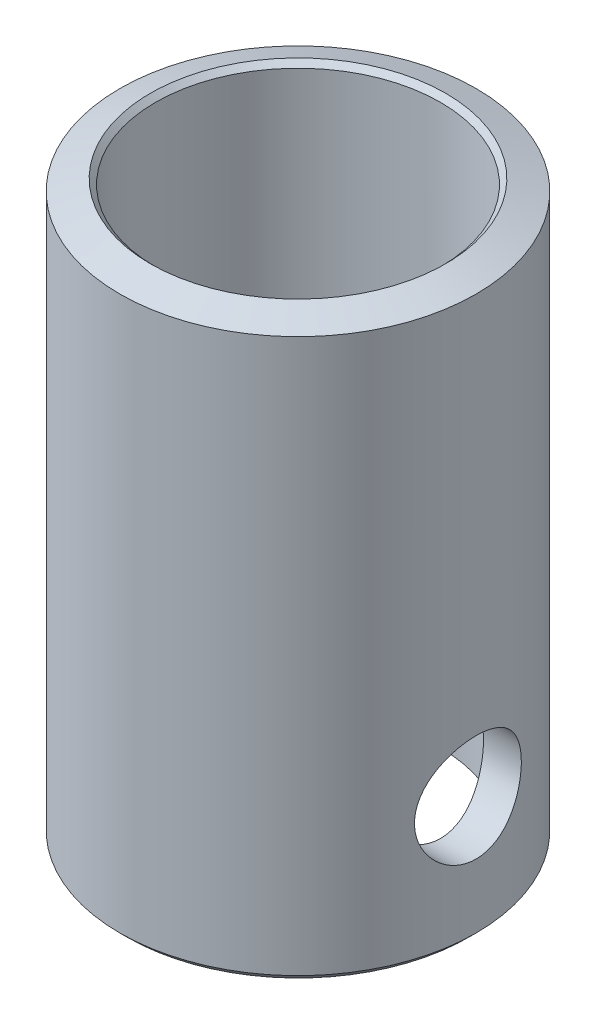
ISO-10303-21;
HEADER;
FILE_DESCRIPTION(('STEP AP214'),'2;1');
FILE_NAME('part.step','',(''),(''),'','','');
FILE_SCHEMA(('AUTOMOTIVE_DESIGN { 1 0 10303 214 1 1 1 1 }'));
ENDSEC;
DATA;
#1=APPLICATION_CONTEXT('core data for automotive mechanical design processes');
#2=APPLICATION_PROTOCOL_DEFINITION('international standard','automotive_design',2000,#1);
#3=PRODUCT_CONTEXT('',#1,'mechanical');
#4=PRODUCT('Part','Part','',(#3));
#5=PRODUCT_RELATED_PRODUCT_CATEGORY('part','',(#4));
#6=PRODUCT_DEFINITION_FORMATION('','',#4);
#7=PRODUCT_DEFINITION_CONTEXT('part definition',#1,'design');
#8=PRODUCT_DEFINITION('design','',#6,#7);
#9=PRODUCT_DEFINITION_SHAPE('','',#8);
#10=(LENGTH_UNIT() NAMED_UNIT(*) SI_UNIT(.MILLI.,.METRE.));
#11=(NAMED_UNIT(*) PLANE_ANGLE_UNIT() SI_UNIT($,.RADIAN.));
#12=(NAMED_UNIT(*) SI_UNIT($,.STERADIAN.) SOLID_ANGLE_UNIT());
#13=UNCERTAINTY_MEASURE_WITH_UNIT(LENGTH_MEASURE(1.E-05),#10,'distance_accuracy_value','');
#14=(GEOMETRIC_REPRESENTATION_CONTEXT(3) GLOBAL_UNCERTAINTY_ASSIGNED_CONTEXT((#13)) GLOBAL_UNIT_ASSIGNED_CONTEXT((#10,
#11,#12)) REPRESENTATION_CONTEXT('',''));
#15=CARTESIAN_POINT('',(0.,0.,0.));
#16=DIRECTION('',(0.,0.,1.));
#17=DIRECTION('',(1.,0.,0.));
#18=AXIS2_PLACEMENT_3D('',#15,#16,#17);
#19=CARTESIAN_POINT('',(0.,0.,0.));
#20=DIRECTION('',(0.,1.,0.));
#21=DIRECTION('',(0.,0.,1.));
#22=AXIS2_PLACEMENT_3D('',#19,#20,#21);
#23=PLANE('',#22);
#24=CARTESIAN_POINT('',(0.,0.,0.));
#25=DIRECTION('',(0.,1.,0.));
#26=DIRECTION('',(0.,0.,1.));
#27=AXIS2_PLACEMENT_3D('',#24,#25,#26);
#28=CIRCLE('',#27,4.2);
#29=CARTESIAN_POINT('',(0.,0.,4.2));
#30=VERTEX_POINT('',#29);
#31=EDGE_CURVE('E46',#30,#30,#28,.T.);
#32=ORIENTED_EDGE('',*,*,#31,.T.);
#33=EDGE_LOOP('',(#32));
#34=FACE_BOUND('',#33,.T.);
#35=CARTESIAN_POINT('',(0.,0.,0.));
#36=DIRECTION('',(0.,1.,0.));
#37=DIRECTION('',(0.,0.,1.));
#38=AXIS2_PLACEMENT_3D('',#35,#36,#37);
#39=CIRCLE('',#38,4.8);
#40=CARTESIAN_POINT('',(0.,0.,4.8));
#41=VERTEX_POINT('',#40);
#42=EDGE_CURVE('E51',#41,#41,#39,.F.);
#43=ORIENTED_EDGE('',*,*,#42,.T.);
#44=EDGE_LOOP('',(#43));
#45=FACE_BOUND('',#44,.T.);
#46=ADVANCED_FACE('F31',(#34,#45),#23,.F.);
#47=CARTESIAN_POINT('',(0.,16.1,0.));
#48=DIRECTION('',(0.,-1.,0.));
#49=DIRECTION('',(0.,0.,-1.));
#50=AXIS2_PLACEMENT_3D('',#47,#48,#49);
#51=CYLINDRICAL_SURFACE('',#50,5.);
#52=CARTESIAN_POINT('',(4.76969600708473,3.5,-1.49999999999998));
#53=CARTESIAN_POINT('',(4.7696968572698,3.5821945479424,-1.49999897633762));
#54=CARTESIAN_POINT('',(4.77184390209069,3.66439922414403,-1.4932210816714));
#55=CARTESIAN_POINT('',(4.780165783029,3.82640524959194,-1.46635844446747));
#56=CARTESIAN_POINT('',(4.78634196493468,3.90620578650147,-1.44626925573576));
#57=CARTESIAN_POINT('',(4.80196102485633,4.06103472827173,-1.39352753269954));
#58=CARTESIAN_POINT('',(4.81139846703233,4.13607082963309,-1.36089589394242));
#59=CARTESIAN_POINT('',(4.83246932547567,4.2796219339953,-1.28406421917927));
#60=CARTESIAN_POINT('',(4.8441030704102,4.34813595868444,-1.23986245137051));
#61=CARTESIAN_POINT('',(4.86866862185766,4.47886639057738,-1.13964754141625));
#62=CARTESIAN_POINT('',(4.88162808311636,4.54084589794629,-1.08333207175805));
#63=CARTESIAN_POINT('',(4.90714861936757,4.65463795132251,-0.961136237579581));
#64=CARTESIAN_POINT('',(4.91970964297705,4.70644919044988,-0.895254645461094));
#65=CARTESIAN_POINT('',(4.94333214579389,4.79946269983331,-0.754111437793673));
#66=CARTESIAN_POINT('',(4.95435724342404,4.84042342444281,-0.678684021335797));
#67=CARTESIAN_POINT('',(4.97334435920684,4.90898725904276,-0.521624645369336));
#68=CARTESIAN_POINT('',(4.98130703789496,4.93659324985745,-0.439994028387894));
#69=CARTESIAN_POINT('',(4.99307646003589,4.97688000109051,-0.275323852630812));
#70=CARTESIAN_POINT('',(4.99699557369339,4.9899651276527,-0.192391398953783));
#71=CARTESIAN_POINT('',(5.00063201501348,5.00211732464644,-0.0254218237492973));
#72=CARTESIAN_POINT('',(5.00035022521079,5.00118733940196,0.0586150620503859));
#73=CARTESIAN_POINT('',(4.99569603817658,4.98560713145698,0.222571156600178));
#74=CARTESIAN_POINT('',(4.9914542020526,4.97139480619013,0.302536267641359));
#75=CARTESIAN_POINT('',(4.97951522112593,4.93036866400571,0.458889213442544));
#76=CARTESIAN_POINT('',(4.97181785750586,4.90355404905733,0.535276821322864));
#77=CARTESIAN_POINT('',(4.95365220986963,4.83778797658144,0.683347326351298));
#78=CARTESIAN_POINT('',(4.94315269676706,4.79869879719273,0.754965064694495));
#79=CARTESIAN_POINT('',(4.92049640648069,4.70960214757177,0.890764673783173));
#80=CARTESIAN_POINT('',(4.90833923637777,4.65959208703652,0.954944774872148));
#81=CARTESIAN_POINT('',(4.88311550488165,4.5478022492484,1.07666048152982));
#82=CARTESIAN_POINT('',(4.87003195321461,4.48564308097026,1.13384458040113));
#83=CARTESIAN_POINT('',(4.84483979887497,4.35248998210995,1.23707651539825));
#84=CARTESIAN_POINT('',(4.83273129317019,4.28149517461077,1.28312324482854));
#85=CARTESIAN_POINT('',(4.81077903197677,4.13176053075101,1.36313995335452));
#86=CARTESIAN_POINT('',(4.80095810695956,4.05295295413708,1.39698989237681));
#87=CARTESIAN_POINT('',(4.78496392548435,3.89039279155446,1.45083362878415));
#88=CARTESIAN_POINT('',(4.77878947915829,3.80664182846544,1.47083194640562));
#89=CARTESIAN_POINT('',(4.77104849541241,3.63991763926072,1.49574770282167));
#90=CARTESIAN_POINT('',(4.7693187867044,3.55703177610602,1.50119946380214));
#91=CARTESIAN_POINT('',(4.77021192441923,3.39152709999013,1.49835947233064));
#92=CARTESIAN_POINT('',(4.77283416156589,3.30890825126915,1.49006964371332));
#93=CARTESIAN_POINT('',(4.78197558554912,3.14851162202913,1.46045763574192));
#94=CARTESIAN_POINT('',(4.78839176507488,3.07066383573648,1.43947961431282));
#95=CARTESIAN_POINT('',(4.80429141231227,2.91959830918508,1.38548577747942));
#96=CARTESIAN_POINT('',(4.81377535359073,2.84638128585943,1.35246810342761));
#97=CARTESIAN_POINT('',(4.83505835023047,2.70448253592787,1.27431871196502));
#98=CARTESIAN_POINT('',(4.84691271069798,2.63597527901421,1.22888564172731));
#99=CARTESIAN_POINT('',(4.87148205646987,2.5073618938192,1.12755301600386));
#100=CARTESIAN_POINT('',(4.88419724730003,2.44725778238721,1.07165095534898));
#101=CARTESIAN_POINT('',(4.90963633548158,2.33481959418526,0.948455132493616));
#102=CARTESIAN_POINT('',(4.92234245063004,2.28286437101302,0.880811065857451));
#103=CARTESIAN_POINT('',(4.9458485174865,2.19103329897225,0.737461784590266));
#104=CARTESIAN_POINT('',(4.95664856384717,2.15115685021854,0.661756970543961));
#105=CARTESIAN_POINT('',(4.97505970474957,2.0849999694317,0.504935504705238));
#106=CARTESIAN_POINT('',(4.98269453424965,2.05861798384102,0.423864622037856));
#107=CARTESIAN_POINT('',(4.99401979596827,2.01993908110958,0.258169966504605));
#108=CARTESIAN_POINT('',(4.9977113567088,2.00763813405158,0.17354721735478));
#109=CARTESIAN_POINT('',(5.00066544081399,1.9977769559455,0.00665215388276053));
#110=CARTESIAN_POINT('',(5.00009305111322,1.99966730459217,-0.0755851790861889));
#111=CARTESIAN_POINT('',(4.99497264465037,2.01682163249912,-0.238519481164386));
#112=CARTESIAN_POINT('',(4.99042485330463,2.03208485348044,-0.319216537346511));
#113=CARTESIAN_POINT('',(4.97791168358327,2.07521166139962,-0.475935813041341));
#114=CARTESIAN_POINT('',(4.96998352900866,2.10293818064901,-0.551998927351374));
#115=CARTESIAN_POINT('',(4.9515294303945,2.17008191450719,-0.698433237752036));
#116=CARTESIAN_POINT('',(4.94100305949946,2.20950105028619,-0.768803496050562));
#117=CARTESIAN_POINT('',(4.91803965828229,2.30037345743004,-0.904301892420546));
#118=CARTESIAN_POINT('',(4.9055522692356,2.35217143000077,-0.969190250076749));
#119=CARTESIAN_POINT('',(4.88023537212334,2.4657103883328,-1.08953757134593));
#120=CARTESIAN_POINT('',(4.86740576641079,2.52745423789815,-1.14499380960192));
#121=CARTESIAN_POINT('',(4.84240680631319,2.66134077831051,-1.24656269394547));
#122=CARTESIAN_POINT('',(4.83026852693486,2.73373855339044,-1.29234759757955));
#123=CARTESIAN_POINT('',(4.80852547508793,2.88555517416102,-1.37104313528774));
#124=CARTESIAN_POINT('',(4.79891948596956,2.96497062360119,-1.40395995557287));
#125=CARTESIAN_POINT('',(4.78427816717595,3.11974043160627,-1.45301942532948));
#126=CARTESIAN_POINT('',(4.77886154840521,3.19460864693099,-1.4705885901123));
#127=CARTESIAN_POINT('',(4.77157042597167,3.34631522249577,-1.49407818835142));
#128=CARTESIAN_POINT('',(4.76969521221431,3.42315318464525,-1.50000095706094));
#129=CARTESIAN_POINT('',(4.76969600708473,3.5,-1.49999999999998));
#130=B_SPLINE_CURVE_WITH_KNOTS('',3,(#52,#53,#54,#55,#56,#57,#58,#59,#60,#61,#62,#63,#64,#65,
#66,#67,#68,#69,#70,#71,#72,#73,#74,#75,#76,#77,#78,#79,#80,#81,#82,#83,#84,#85,#86,#87,#88,#89,
#90,#91,#92,#93,#94,#95,#96,#97,#98,#99,#100,#101,#102,#103,#104,#105,#106,#107,#108,#109,#110,
#111,#112,#113,#114,#115,#116,#117,#118,#119,#120,#121,#122,#123,#124,#125,#126,#127,#128,#129),
.UNSPECIFIED.,.T.,.F.,(4,2,2,2,2,2,2,2,2,2,2,2,2,2,2,2,2,2,2,2,2,2,2,2,2,2,2,2,2,2,2,2,2,2,2,2,
2,2,4),(0.,0.246300165915543,0.492682641689,0.738656414466194,0.984667025370102,
1.23773150007984,1.49082847871273,1.74915939273645,2.00743455587877,2.25832140149558,
2.5091555410144,2.7520012599088,2.99486235890376,3.24055209335676,3.4863001659083,
3.74152147023278,3.99676812491863,4.25446238246266,4.51207250628411,4.76008080790309,
5.00805439107388,5.24958594938817,5.49115481045787,5.73920731809388,5.98731925928923,
6.24479506100602,6.50225807324202,6.75775391814325,7.01317662321682,7.2587630391122,
7.50433553047754,7.74727096872219,7.99024634491378,8.24099627054488,8.4918185262989,
8.75011639669147,9.00828993963944,9.23861153857447,9.4688869503356),.UNSPECIFIED.);
#131=CARTESIAN_POINT('',(4.76969600708473,3.5,-1.49999999999998));
#132=VERTEX_POINT('',#131);
#133=EDGE_CURVE('E87',#132,#132,#130,.T.);
#134=ORIENTED_EDGE('',*,*,#133,.F.);
#135=EDGE_LOOP('',(#134));
#136=FACE_BOUND('',#135,.T.);
#137=CARTESIAN_POINT('',(-1.5,3.5,-4.76969600708473));
#138=CARTESIAN_POINT('',(-1.49999897633764,3.5821945479424,-4.7696968572698));
#139=CARTESIAN_POINT('',(-1.49322108167142,3.66439922414403,-4.77184390209069));
#140=CARTESIAN_POINT('',(-1.46635844446749,3.82640524959194,-4.780165783029));
#141=CARTESIAN_POINT('',(-1.44626925573578,3.90620578650147,-4.78634196493468));
#142=CARTESIAN_POINT('',(-1.39352753269955,4.06103472827173,-4.80196102485633));
#143=CARTESIAN_POINT('',(-1.36089589394243,4.13607082963309,-4.81139846703232));
#144=CARTESIAN_POINT('',(-1.28406421917929,4.2796219339953,-4.83246932547567));
#145=CARTESIAN_POINT('',(-1.23986245137053,4.34813595868444,-4.84410307041019));
#146=CARTESIAN_POINT('',(-1.13964754141627,4.47886639057738,-4.86866862185765));
#147=CARTESIAN_POINT('',(-1.08333207175807,4.54084589794629,-4.88162808311636));
#148=CARTESIAN_POINT('',(-0.961136237579598,4.65463795132251,-4.90714861936757));
#149=CARTESIAN_POINT('',(-0.895254645461111,4.70644919044988,-4.91970964297705));
#150=CARTESIAN_POINT('',(-0.754111437793689,4.79946269983331,-4.94333214579389));
#151=CARTESIAN_POINT('',(-0.678684021335814,4.84042342444281,-4.95435724342404));
#152=CARTESIAN_POINT('',(-0.521624645369353,4.90898725904276,-4.97334435920684));
#153=CARTESIAN_POINT('',(-0.439994028387911,4.93659324985745,-4.98130703789495));
#154=CARTESIAN_POINT('',(-0.275323852630828,4.97688000109051,-4.99307646003589));
#155=CARTESIAN_POINT('',(-0.1923913989538,4.9899651276527,-4.99699557369338));
#156=CARTESIAN_POINT('',(-0.0254218237493141,5.00211732464644,-5.00063201501348));
#157=CARTESIAN_POINT('',(0.0586150620503689,5.00118733940196,-5.00035022521079));
#158=CARTESIAN_POINT('',(0.222571156600161,4.98560713145698,-4.99569603817659));
#159=CARTESIAN_POINT('',(0.302536267641342,4.97139480619013,-4.9914542020526));
#160=CARTESIAN_POINT('',(0.458889213442527,4.93036866400571,-4.97951522112593));
#161=CARTESIAN_POINT('',(0.535276821322846,4.90355404905733,-4.97181785750586));
#162=CARTESIAN_POINT('',(0.683347326351281,4.83778797658144,-4.95365220986963));
#163=CARTESIAN_POINT('',(0.754965064694478,4.79869879719273,-4.94315269676706));
#164=CARTESIAN_POINT('',(0.890764673783156,4.70960214757177,-4.92049640648069));
#165=CARTESIAN_POINT('',(0.954944774872131,4.65959208703652,-4.90833923637778));
#166=CARTESIAN_POINT('',(1.0766604815298,4.5478022492484,-4.88311550488165));
#167=CARTESIAN_POINT('',(1.13384458040111,4.48564308097026,-4.87003195321461));
#168=CARTESIAN_POINT('',(1.23707651539824,4.35248998210995,-4.84483979887497));
#169=CARTESIAN_POINT('',(1.28312324482853,4.28149517461077,-4.8327312931702));
#170=CARTESIAN_POINT('',(1.3631399533545,4.13176053075101,-4.81077903197678));
#171=CARTESIAN_POINT('',(1.39698989237679,4.05295295413708,-4.80095810695957));
#172=CARTESIAN_POINT('',(1.45083362878413,3.89039279155446,-4.78496392548436));
#173=CARTESIAN_POINT('',(1.4708319464056,3.80664182846544,-4.7787894791583));
#174=CARTESIAN_POINT('',(1.49574770282165,3.63991763926072,-4.77104849541241));
#175=CARTESIAN_POINT('',(1.50119946380212,3.55703177610602,-4.7693187867044));
#176=CARTESIAN_POINT('',(1.49835947233062,3.39152709999013,-4.77021192441924));
#177=CARTESIAN_POINT('',(1.4900696437133,3.30890825126915,-4.77283416156589));
#178=CARTESIAN_POINT('',(1.4604576357419,3.14851162202913,-4.78197558554912));
#179=CARTESIAN_POINT('',(1.4394796143128,3.07066383573648,-4.78839176507489));
#180=CARTESIAN_POINT('',(1.3854857774794,2.91959830918508,-4.80429141231227));
#181=CARTESIAN_POINT('',(1.3524681034276,2.84638128585943,-4.81377535359073));
#182=CARTESIAN_POINT('',(1.274318711965,2.70448253592787,-4.83505835023047));
#183=CARTESIAN_POINT('',(1.22888564172729,2.63597527901421,-4.84691271069799));
#184=CARTESIAN_POINT('',(1.12755301600385,2.5073618938192,-4.87148205646987));
#185=CARTESIAN_POINT('',(1.07165095534897,2.44725778238721,-4.88419724730003));
#186=CARTESIAN_POINT('',(0.948455132493599,2.33481959418526,-4.90963633548158));
#187=CARTESIAN_POINT('',(0.880811065857434,2.28286437101302,-4.92234245063004));
#188=CARTESIAN_POINT('',(0.737461784590249,2.19103329897225,-4.94584851748651));
#189=CARTESIAN_POINT('',(0.661756970543944,2.15115685021854,-4.95664856384717));
#190=CARTESIAN_POINT('',(0.504935504705221,2.0849999694317,-4.97505970474957));
#191=CARTESIAN_POINT('',(0.423864622037839,2.05861798384102,-4.98269453424966));
#192=CARTESIAN_POINT('',(0.258169966504588,2.01993908110958,-4.99401979596827));
#193=CARTESIAN_POINT('',(0.173547217354763,2.00763813405158,-4.9977113567088));
#194=CARTESIAN_POINT('',(0.00665215388274322,1.9977769559455,-5.00066544081399));
#195=CARTESIAN_POINT('',(-0.075585179086206,1.99966730459217,-5.00009305111322));
#196=CARTESIAN_POINT('',(-0.238519481164403,2.01682163249912,-4.99497264465037));
#197=CARTESIAN_POINT('',(-0.319216537346528,2.03208485348044,-4.99042485330463));
#198=CARTESIAN_POINT('',(-0.475935813041358,2.07521166139962,-4.97791168358327));
#199=CARTESIAN_POINT('',(-0.551998927351391,2.10293818064901,-4.96998352900866));
#200=CARTESIAN_POINT('',(-0.698433237752052,2.17008191450719,-4.9515294303945));
#201=CARTESIAN_POINT('',(-0.768803496050579,2.20950105028619,-4.94100305949946));
#202=CARTESIAN_POINT('',(-0.904301892420563,2.30037345743004,-4.91803965828228));
#203=CARTESIAN_POINT('',(-0.969190250076767,2.35217143000077,-4.90555226923559));
#204=CARTESIAN_POINT('',(-1.08953757134594,2.4657103883328,-4.88023537212334));
#205=CARTESIAN_POINT('',(-1.14499380960194,2.52745423789815,-4.86740576641079));
#206=CARTESIAN_POINT('',(-1.24656269394549,2.66134077831051,-4.84240680631319));
#207=CARTESIAN_POINT('',(-1.29234759757956,2.73373855339044,-4.83026852693485));
#208=CARTESIAN_POINT('',(-1.37104313528776,2.88555517416102,-4.80852547508793));
#209=CARTESIAN_POINT('',(-1.40395995557289,2.96497062360119,-4.79891948596956));
#210=CARTESIAN_POINT('',(-1.4530194253295,3.11974043160627,-4.78427816717595));
#211=CARTESIAN_POINT('',(-1.47058859011232,3.19460864693099,-4.7788615484052));
#212=CARTESIAN_POINT('',(-1.49407818835144,3.34631522249577,-4.77157042597167));
#213=CARTESIAN_POINT('',(-1.50000095706095,3.42315318464525,-4.7696952122143));
#214=CARTESIAN_POINT('',(-1.5,3.5,-4.76969600708473));
#215=B_SPLINE_CURVE_WITH_KNOTS('',3,(#137,#138,#139,#140,#141,#142,#143,#144,#145,#146,#147,
#148,#149,#150,#151,#152,#153,#154,#155,#156,#157,#158,#159,#160,#161,#162,#163,#164,#165,#166,
#167,#168,#169,#170,#171,#172,#173,#174,#175,#176,#177,#178,#179,#180,#181,#182,#183,#184,#185,
#186,#187,#188,#189,#190,#191,#192,#193,#194,#195,#196,#197,#198,#199,#200,#201,#202,#203,#204,
#205,#206,#207,#208,#209,#210,#211,#212,#213,#214),.UNSPECIFIED.,.T.,.F.,(4,2,2,2,2,2,2,2,2,2,2,
2,2,2,2,2,2,2,2,2,2,2,2,2,2,2,2,2,2,2,2,2,2,2,2,2,2,2,4),(0.,0.246300165915543,0.492682641689,
0.738656414466194,0.984667025370101,1.23773150007984,1.49082847871273,1.74915939273645,
2.00743455587877,2.25832140149558,2.5091555410144,2.7520012599088,2.99486235890376,
3.24055209335676,3.4863001659083,3.74152147023278,3.99676812491863,4.25446238246266,
4.51207250628411,4.76008080790309,5.00805439107388,5.24958594938817,5.49115481045787,
5.73920731809388,5.98731925928923,6.24479506100602,6.50225807324202,6.75775391814325,
7.01317662321682,7.2587630391122,7.50433553047755,7.74727096872219,7.99024634491378,
8.24099627054488,8.4918185262989,8.75011639669147,9.00828993963944,9.23861153857448,
9.4688869503356),.UNSPECIFIED.);
#216=CARTESIAN_POINT('',(-1.5,3.5,-4.76969600708473));
#217=VERTEX_POINT('',#216);
#218=EDGE_CURVE('E67',#217,#217,#215,.T.);
#219=ORIENTED_EDGE('',*,*,#218,.F.);
#220=EDGE_LOOP('',(#219));
#221=FACE_BOUND('',#220,.T.);
#222=CARTESIAN_POINT('',(0.,15.7360297657338,0.));
#223=DIRECTION('',(0.,1.,0.));
#224=DIRECTION('',(0.,0.,1.));
#225=AXIS2_PLACEMENT_3D('',#222,#223,#224);
#226=CIRCLE('',#225,5.);
#227=CARTESIAN_POINT('',(0.,15.7360297657338,5.));
#228=VERTEX_POINT('',#227);
#229=EDGE_CURVE('E10',#228,#228,#226,.F.);
#230=ORIENTED_EDGE('',*,*,#229,.T.);
#231=EDGE_LOOP('',(#230));
#232=FACE_BOUND('',#231,.T.);
#233=CARTESIAN_POINT('',(0.,0.199999999999995,0.));
#234=DIRECTION('',(0.,1.,0.));
#235=DIRECTION('',(0.,0.,1.));
#236=AXIS2_PLACEMENT_3D('',#233,#234,#235);
#237=CIRCLE('',#236,5.);
#238=CARTESIAN_POINT('',(0.,0.199999999999995,5.));
#239=VERTEX_POINT('',#238);
#240=EDGE_CURVE('E42',#239,#239,#237,.T.);
#241=ORIENTED_EDGE('',*,*,#240,.T.);
#242=EDGE_LOOP('',(#241));
#243=FACE_BOUND('',#242,.T.);
#244=ADVANCED_FACE('F102',(#136,#221,#232,#243),#51,.T.);
#245=CARTESIAN_POINT('',(0.,16.1,0.));
#246=DIRECTION('',(0.,-1.,0.));
#247=DIRECTION('',(0.,0.,-1.));
#248=AXIS2_PLACEMENT_3D('',#245,#246,#247);
#249=CYLINDRICAL_SURFACE('',#248,4.);
#250=CARTESIAN_POINT('',(3.70809924354784,3.5,-1.49999999999999));
#251=CARTESIAN_POINT('',(3.70809640633807,3.58100748372079,-1.50000304106108));
#252=CARTESIAN_POINT('',(3.71078260240986,3.66199492250364,-1.49341597549486));
#253=CARTESIAN_POINT('',(3.72116159304967,3.8215280829132,-1.46736187895467));
#254=CARTESIAN_POINT('',(3.72885423767113,3.90007387759501,-1.44789523373262));
#255=CARTESIAN_POINT('',(3.74825480280901,4.05237537161353,-1.39689657610573));
#256=CARTESIAN_POINT('',(3.75995309569261,4.12614205665108,-1.36539347266347));
#257=CARTESIAN_POINT('',(3.78603134206599,4.26737189681884,-1.29131856742696));
#258=CARTESIAN_POINT('',(3.80041210067324,4.33483315028252,-1.24874344095037));
#259=CARTESIAN_POINT('',(3.83103574665713,4.46489031162282,-1.15146661374161));
#260=CARTESIAN_POINT('',(3.84733341923604,4.52712852962939,-1.09630381213305));
#261=CARTESIAN_POINT('',(3.87949750628547,4.64172281467149,-0.976395839778913));
#262=CARTESIAN_POINT('',(3.89536382814785,4.69407677374185,-0.911648630256666));
#263=CARTESIAN_POINT('',(3.92552873936553,4.78913951229561,-0.771694655177586));
#264=CARTESIAN_POINT('',(3.93975561223506,4.83145947471586,-0.696206947538014));
#265=CARTESIAN_POINT('',(3.96438007973848,4.90265117252491,-0.538555771965233));
#266=CARTESIAN_POINT('',(3.97477900217006,4.93152757199197,-0.456394630933522));
#267=CARTESIAN_POINT('',(3.9901869710344,4.97375789577462,-0.291489341676818));
#268=CARTESIAN_POINT('',(3.99540915214774,4.98772762744046,-0.208923197281582));
#269=CARTESIAN_POINT('',(4.0006401410794,5.00172120094499,-0.0424643637947719));
#270=CARTESIAN_POINT('',(4.00065064414902,5.00174957761871,0.0414278850628472));
#271=CARTESIAN_POINT('',(3.99559265903894,4.98821823853483,0.20374354306449));
#272=CARTESIAN_POINT('',(3.99077541996683,4.97533070205119,0.282232178266914));
#273=CARTESIAN_POINT('',(3.97693274932263,4.93746408477445,0.435839217984406));
#274=CARTESIAN_POINT('',(3.96790701975577,4.91248414773796,0.510957383430312));
#275=CARTESIAN_POINT('',(3.9463776916753,4.85082954832415,0.656989017303118));
#276=CARTESIAN_POINT('',(3.93382539470077,4.81398999473159,0.727825392287323));
#277=CARTESIAN_POINT('',(3.90651310225279,4.72980790307061,0.862486607957573));
#278=CARTESIAN_POINT('',(3.8917523951284,4.6824619769824,0.926309176932337));
#279=CARTESIAN_POINT('',(3.86052529655816,4.57537271371681,1.04909048680095));
#280=CARTESIAN_POINT('',(3.84400963763882,4.51506608434957,1.10754614526349));
#281=CARTESIAN_POINT('',(3.81182460645722,4.38540700667844,1.21370395569344));
#282=CARTESIAN_POINT('',(3.79615544748847,4.31605229341336,1.26140340692901));
#283=CARTESIAN_POINT('',(3.76712703500335,4.16828053253718,1.34565611808153));
#284=CARTESIAN_POINT('',(3.75382677150276,4.08969650631393,1.38193847851832));
#285=CARTESIAN_POINT('',(3.73172438629002,3.92690377483243,1.44056464441502));
#286=CARTESIAN_POINT('',(3.72291976205782,3.84269822840631,1.46291620605596));
#287=CARTESIAN_POINT('',(3.71139597222848,3.67602403768405,1.4919019170967));
#288=CARTESIAN_POINT('',(3.70836785241536,3.59371589446386,1.49933521158967));
#289=CARTESIAN_POINT('',(3.70786539525015,3.42899064325826,1.50057885636273));
#290=CARTESIAN_POINT('',(3.71038967003986,3.34657356764753,1.49439261093763));
#291=CARTESIAN_POINT('',(3.72039381629734,3.18807007771232,1.46929733520158));
#292=CARTESIAN_POINT('',(3.72763276216448,3.11186886423534,1.45100618334226));
#293=CARTESIAN_POINT('',(3.74596487046361,2.96365205527981,1.40299774640639));
#294=CARTESIAN_POINT('',(3.75705882250172,2.89163732083186,1.37327812034624));
#295=CARTESIAN_POINT('',(3.78236243116079,2.75083556192379,1.30200292275279));
#296=CARTESIAN_POINT('',(3.79667328892065,2.68227070786266,1.26004545177048));
#297=CARTESIAN_POINT('',(3.82662814294291,2.55287101827396,1.1659131786248));
#298=CARTESIAN_POINT('',(3.84227262594077,2.49203902537537,1.11373463696436));
#299=CARTESIAN_POINT('',(3.87433046553184,2.3758316268049,0.996727340900951));
#300=CARTESIAN_POINT('',(3.89072969357027,2.32104659123125,0.931306341491075));
#301=CARTESIAN_POINT('',(3.92149874963302,2.22316163241056,0.791797471753164));
#302=CARTESIAN_POINT('',(3.93586857107664,2.18006174705416,0.717709573322687));
#303=CARTESIAN_POINT('',(3.96094985704552,2.10705394380039,0.56301632946849));
#304=CARTESIAN_POINT('',(3.9716738133801,2.0771008762074,0.48243443306464));
#305=CARTESIAN_POINT('',(3.98829436712571,2.03134358615008,0.316881887523268));
#306=CARTESIAN_POINT('',(3.99419323299412,2.0155327145776,0.231913320723606));
#307=CARTESIAN_POINT('',(4.00028407317073,1.99922559724517,0.0653355852738293));
#308=CARTESIAN_POINT('',(4.00078860953764,1.99789051694101,-0.0161807680608313));
#309=CARTESIAN_POINT('',(3.99684889809224,2.00841515944539,-0.17822678641241));
#310=CARTESIAN_POINT('',(3.9924052471313,2.02027329088586,-0.258756569245243));
#311=CARTESIAN_POINT('',(3.97921089603771,2.05625885149362,-0.414548248377112));
#312=CARTESIAN_POINT('',(3.97056791378018,2.08007990587836,-0.489890731068821));
#313=CARTESIAN_POINT('',(3.9498778362099,2.13901001338436,-0.635515473006376));
#314=CARTESIAN_POINT('',(3.93783009655664,2.17412120330475,-0.705796771275529));
#315=CARTESIAN_POINT('',(3.91090618300074,2.25631394350481,-0.8425401769944));
#316=CARTESIAN_POINT('',(3.89593240108829,2.30383664051415,-0.908717548846837));
#317=CARTESIAN_POINT('',(3.86499507694845,2.40880783018761,-1.03241734752335));
#318=CARTESIAN_POINT('',(3.84903118274027,2.46625986580788,-1.08993667125589));
#319=CARTESIAN_POINT('',(3.81688129739176,2.59306413164506,-1.19781214236194));
#320=CARTESIAN_POINT('',(3.8007280534916,2.66288440215431,-1.24762999816024));
#321=CARTESIAN_POINT('',(3.77098325003639,2.81041586957333,-1.33484709556842));
#322=CARTESIAN_POINT('',(3.75739195631217,2.88812788405348,-1.37224504878155));
#323=CARTESIAN_POINT('',(3.73402269853267,3.05295568097541,-1.43465886974259));
#324=CARTESIAN_POINT('',(3.7244380329086,3.14033436651178,-1.45906002899521));
#325=CARTESIAN_POINT('',(3.71147994336316,3.31848527195579,-1.49172356722078));
#326=CARTESIAN_POINT('',(3.70810242179737,3.40925521270999,-1.49999659339569));
#327=CARTESIAN_POINT('',(3.70809924354784,3.5,-1.49999999999999));
#328=B_SPLINE_CURVE_WITH_KNOTS('',3,(#250,#251,#252,#253,#254,#255,#256,#257,#258,#259,#260,
#261,#262,#263,#264,#265,#266,#267,#268,#269,#270,#271,#272,#273,#274,#275,#276,#277,#278,#279,
#280,#281,#282,#283,#284,#285,#286,#287,#288,#289,#290,#291,#292,#293,#294,#295,#296,#297,#298,
#299,#300,#301,#302,#303,#304,#305,#306,#307,#308,#309,#310,#311,#312,#313,#314,#315,#316,#317,
#318,#319,#320,#321,#322,#323,#324,#325,#326,#327),.UNSPECIFIED.,.T.,.F.,(4,2,2,2,2,2,2,2,2,2,2,
2,2,2,2,2,2,2,2,2,2,2,2,2,2,2,2,2,2,2,2,2,2,2,2,2,2,2,4),(0.,0.24268454141617,0.485361814598855,
0.72745985675703,0.969630679682933,1.22274652401128,1.47591628822983,1.73770072136421,
1.9993942638133,2.24980018489679,2.50012465404857,2.73806472803194,2.97602165263335,
3.21744131210668,3.45893893628976,3.71456675065875,3.97025867827335,4.23162592252966,
4.49284751635474,4.73965657740485,4.98640395388884,5.22143845928199,5.45652113429526,
5.70041561005821,5.94439948466355,6.20385016993624,6.46330169650178,6.72185508890168,
6.98028685560127,7.22365720549936,7.4669982031948,7.7044027400389,7.94185223512831,
8.18928323676987,8.43680270894964,8.69738599542079,8.95799630544242,9.23003178870926,
9.50188762323053),.UNSPECIFIED.);
#329=CARTESIAN_POINT('',(3.70809924354784,3.5,-1.49999999999999));
#330=VERTEX_POINT('',#329);
#331=EDGE_CURVE('E90',#330,#330,#328,.T.);
#332=ORIENTED_EDGE('',*,*,#331,.T.);
#333=EDGE_LOOP('',(#332));
#334=FACE_BOUND('',#333,.T.);
#335=CARTESIAN_POINT('',(-1.5,3.5,-3.70809924354783));
#336=CARTESIAN_POINT('',(-1.50000304106109,3.58100748372079,-3.70809640633806));
#337=CARTESIAN_POINT('',(-1.49341597549487,3.66199492250364,-3.71078260240986));
#338=CARTESIAN_POINT('',(-1.46736187895468,3.8215280829132,-3.72116159304967));
#339=CARTESIAN_POINT('',(-1.44789523373263,3.90007387759501,-3.72885423767112));
#340=CARTESIAN_POINT('',(-1.39689657610574,4.05237537161353,-3.748254802809));
#341=CARTESIAN_POINT('',(-1.36539347266348,4.12614205665108,-3.7599530956926));
#342=CARTESIAN_POINT('',(-1.29131856742698,4.26737189681884,-3.78603134206598));
#343=CARTESIAN_POINT('',(-1.24874344095039,4.33483315028252,-3.80041210067323));
#344=CARTESIAN_POINT('',(-1.15146661374162,4.46489031162282,-3.83103574665713));
#345=CARTESIAN_POINT('',(-1.09630381213306,4.52712852962939,-3.84733341923603));
#346=CARTESIAN_POINT('',(-0.976395839778926,4.64172281467149,-3.87949750628547));
#347=CARTESIAN_POINT('',(-0.91164863025668,4.69407677374185,-3.89536382814785));
#348=CARTESIAN_POINT('',(-0.7716946551776,4.78913951229561,-3.92552873936553));
#349=CARTESIAN_POINT('',(-0.696206947538027,4.83145947471586,-3.93975561223505));
#350=CARTESIAN_POINT('',(-0.538555771965247,4.90265117252491,-3.96438007973848));
#351=CARTESIAN_POINT('',(-0.456394630933535,4.93152757199198,-3.97477900217006));
#352=CARTESIAN_POINT('',(-0.291489341676831,4.97375789577462,-3.9901869710344));
#353=CARTESIAN_POINT('',(-0.208923197281595,4.98772762744046,-3.99540915214774));
#354=CARTESIAN_POINT('',(-0.0424643637947852,5.00172120094499,-4.0006401410794));
#355=CARTESIAN_POINT('',(0.0414278850628337,5.00174957761871,-4.00065064414902));
#356=CARTESIAN_POINT('',(0.203743543064476,4.98821823853483,-3.99559265903894));
#357=CARTESIAN_POINT('',(0.282232178266901,4.97533070205119,-3.99077541996683));
#358=CARTESIAN_POINT('',(0.435839217984392,4.93746408477445,-3.97693274932263));
#359=CARTESIAN_POINT('',(0.510957383430299,4.91248414773796,-3.96790701975577));
#360=CARTESIAN_POINT('',(0.656989017303105,4.85082954832415,-3.94637769167531));
#361=CARTESIAN_POINT('',(0.72782539228731,4.81398999473159,-3.93382539470077));
#362=CARTESIAN_POINT('',(0.86248660795756,4.72980790307061,-3.90651310225279));
#363=CARTESIAN_POINT('',(0.926309176932323,4.6824619769824,-3.8917523951284));
#364=CARTESIAN_POINT('',(1.04909048680094,4.57537271371681,-3.86052529655816));
#365=CARTESIAN_POINT('',(1.10754614526348,4.51506608434957,-3.84400963763883));
#366=CARTESIAN_POINT('',(1.21370395569342,4.38540700667844,-3.81182460645722));
#367=CARTESIAN_POINT('',(1.261403406929,4.31605229341336,-3.79615544748847));
#368=CARTESIAN_POINT('',(1.34565611808152,4.16828053253718,-3.76712703500335));
#369=CARTESIAN_POINT('',(1.38193847851831,4.08969650631393,-3.75382677150277));
#370=CARTESIAN_POINT('',(1.44056464441501,3.92690377483243,-3.73172438629002));
#371=CARTESIAN_POINT('',(1.46291620605595,3.84269822840631,-3.72291976205783));
#372=CARTESIAN_POINT('',(1.49190191709668,3.67602403768405,-3.71139597222848));
#373=CARTESIAN_POINT('',(1.49933521158966,3.59371589446386,-3.70836785241537));
#374=CARTESIAN_POINT('',(1.50057885636272,3.42899064325826,-3.70786539525016));
#375=CARTESIAN_POINT('',(1.49439261093762,3.34657356764753,-3.71038967003987));
#376=CARTESIAN_POINT('',(1.46929733520157,3.18807007771232,-3.72039381629735));
#377=CARTESIAN_POINT('',(1.45100618334225,3.11186886423534,-3.72763276216449));
#378=CARTESIAN_POINT('',(1.40299774640637,2.96365205527981,-3.74596487046362));
#379=CARTESIAN_POINT('',(1.37327812034623,2.89163732083186,-3.75705882250173));
#380=CARTESIAN_POINT('',(1.30200292275278,2.75083556192379,-3.7823624311608));
#381=CARTESIAN_POINT('',(1.26004545177047,2.68227070786266,-3.79667328892065));
#382=CARTESIAN_POINT('',(1.16591317862479,2.55287101827396,-3.82662814294291));
#383=CARTESIAN_POINT('',(1.11373463696435,2.49203902537537,-3.84227262594077));
#384=CARTESIAN_POINT('',(0.996727340900938,2.3758316268049,-3.87433046553184));
#385=CARTESIAN_POINT('',(0.931306341491061,2.32104659123125,-3.89072969357028));
#386=CARTESIAN_POINT('',(0.79179747175315,2.22316163241056,-3.92149874963302));
#387=CARTESIAN_POINT('',(0.717709573322673,2.18006174705416,-3.93586857107664));
#388=CARTESIAN_POINT('',(0.563016329468476,2.10705394380039,-3.96094985704552));
#389=CARTESIAN_POINT('',(0.482434433064626,2.0771008762074,-3.9716738133801));
#390=CARTESIAN_POINT('',(0.316881887523254,2.03134358615008,-3.98829436712571));
#391=CARTESIAN_POINT('',(0.231913320723592,2.0155327145776,-3.99419323299412));
#392=CARTESIAN_POINT('',(0.0653355852738153,1.99922559724517,-4.00028407317073));
#393=CARTESIAN_POINT('',(-0.0161807680608454,1.99789051694101,-4.00078860953764));
#394=CARTESIAN_POINT('',(-0.178226786412424,2.00841515944539,-3.99684889809223));
#395=CARTESIAN_POINT('',(-0.258756569245257,2.02027329088586,-3.9924052471313));
#396=CARTESIAN_POINT('',(-0.414548248377127,2.05625885149362,-3.97921089603771));
#397=CARTESIAN_POINT('',(-0.489890731068835,2.08007990587836,-3.97056791378017));
#398=CARTESIAN_POINT('',(-0.63551547300639,2.13901001338436,-3.9498778362099));
#399=CARTESIAN_POINT('',(-0.705796771275543,2.17412120330475,-3.93783009655664));
#400=CARTESIAN_POINT('',(-0.842540176994413,2.25631394350481,-3.91090618300074));
#401=CARTESIAN_POINT('',(-0.90871754884685,2.30383664051415,-3.89593240108828));
#402=CARTESIAN_POINT('',(-1.03241734752336,2.40880783018761,-3.86499507694844));
#403=CARTESIAN_POINT('',(-1.0899366712559,2.46625986580787,-3.84903118274027));
#404=CARTESIAN_POINT('',(-1.19781214236196,2.59306413164506,-3.81688129739175));
#405=CARTESIAN_POINT('',(-1.24762999816025,2.66288440215431,-3.8007280534916));
#406=CARTESIAN_POINT('',(-1.33484709556843,2.81041586957333,-3.77098325003638));
#407=CARTESIAN_POINT('',(-1.37224504878157,2.88812788405348,-3.75739195631216));
#408=CARTESIAN_POINT('',(-1.4346588697426,3.05295568097541,-3.73402269853266));
#409=CARTESIAN_POINT('',(-1.45906002899523,3.14033436651178,-3.7244380329086));
#410=CARTESIAN_POINT('',(-1.49172356722079,3.31848527195579,-3.71147994336315));
#411=CARTESIAN_POINT('',(-1.49999659339571,3.40925521270999,-3.70810242179736));
#412=CARTESIAN_POINT('',(-1.5,3.5,-3.70809924354783));
#413=B_SPLINE_CURVE_WITH_KNOTS('',3,(#335,#336,#337,#338,#339,#340,#341,#342,#343,#344,#345,
#346,#347,#348,#349,#350,#351,#352,#353,#354,#355,#356,#357,#358,#359,#360,#361,#362,#363,#364,
#365,#366,#367,#368,#369,#370,#371,#372,#373,#374,#375,#376,#377,#378,#379,#380,#381,#382,#383,
#384,#385,#386,#387,#388,#389,#390,#391,#392,#393,#394,#395,#396,#397,#398,#399,#400,#401,#402,
#403,#404,#405,#406,#407,#408,#409,#410,#411,#412),.UNSPECIFIED.,.T.,.F.,(4,2,2,2,2,2,2,2,2,2,2,
2,2,2,2,2,2,2,2,2,2,2,2,2,2,2,2,2,2,2,2,2,2,2,2,2,2,2,4),(0.,0.24268454141617,0.485361814598855,
0.72745985675703,0.969630679682933,1.22274652401128,1.47591628822983,1.73770072136421,
1.9993942638133,2.24980018489679,2.50012465404857,2.73806472803194,2.97602165263335,
3.21744131210668,3.45893893628976,3.71456675065875,3.97025867827335,4.23162592252966,
4.49284751635474,4.73965657740485,4.98640395388884,5.22143845928199,5.45652113429526,
5.70041561005821,5.94439948466355,6.20385016993624,6.46330169650178,6.72185508890168,
6.98028685560127,7.22365720549936,7.4669982031948,7.70440274003891,7.94185223512831,
8.18928323676987,8.43680270894965,8.69738599542079,8.95799630544242,9.23003178870926,
9.50188762323053),.UNSPECIFIED.);
#414=CARTESIAN_POINT('',(-1.5,3.5,-3.70809924354783));
#415=VERTEX_POINT('',#414);
#416=EDGE_CURVE('E60',#415,#415,#413,.T.);
#417=ORIENTED_EDGE('',*,*,#416,.T.);
#418=EDGE_LOOP('',(#417));
#419=FACE_BOUND('',#418,.T.);
#420=CARTESIAN_POINT('',(0.,15.9,0.));
#421=DIRECTION('',(0.,1.,0.));
#422=DIRECTION('',(0.,0.,1.));
#423=AXIS2_PLACEMENT_3D('',#420,#421,#422);
#424=CIRCLE('',#423,4.);
#425=CARTESIAN_POINT('',(0.,15.9,4.));
#426=VERTEX_POINT('',#425);
#427=EDGE_CURVE('E54',#426,#426,#424,.T.);
#428=ORIENTED_EDGE('',*,*,#427,.T.);
#429=EDGE_LOOP('',(#428));
#430=FACE_BOUND('',#429,.T.);
#431=CARTESIAN_POINT('',(0.,0.199999999999999,0.));
#432=DIRECTION('',(0.,1.,0.));
#433=DIRECTION('',(0.,0.,1.));
#434=AXIS2_PLACEMENT_3D('',#431,#432,#433);
#435=CIRCLE('',#434,4.);
#436=CARTESIAN_POINT('',(0.,0.199999999999999,4.));
#437=VERTEX_POINT('',#436);
#438=EDGE_CURVE('E57',#437,#437,#435,.F.);
#439=ORIENTED_EDGE('',*,*,#438,.T.);
#440=EDGE_LOOP('',(#439));
#441=FACE_BOUND('',#440,.T.);
#442=ADVANCED_FACE('F105',(#334,#419,#430,#441),#249,.F.);
#443=CARTESIAN_POINT('',(0.,15.9,0.));
#444=DIRECTION('',(0.,1.,0.));
#445=DIRECTION('',(0.,0.,1.));
#446=AXIS2_PLACEMENT_3D('',#443,#444,#445);
#447=CONICAL_SURFACE('',#446,4.,0.785398163397457);
#448=CARTESIAN_POINT('',(0.,16.0466307658155,0.));
#449=DIRECTION('',(0.,-1.,0.));
#450=DIRECTION('',(0.,0.,-1.));
#451=AXIS2_PLACEMENT_3D('',#448,#449,#450);
#452=CIRCLE('',#451,4.1466307658155);
#453=CARTESIAN_POINT('',(0.,16.0466307658155,-4.1466307658155));
#454=VERTEX_POINT('',#453);
#455=EDGE_CURVE('E38',#454,#454,#452,.F.);
#456=ORIENTED_EDGE('',*,*,#455,.T.);
#457=EDGE_LOOP('',(#456));
#458=FACE_BOUND('',#457,.T.);
#459=ORIENTED_EDGE('',*,*,#427,.F.);
#460=EDGE_LOOP('',(#459));
#461=FACE_BOUND('',#460,.T.);
#462=ADVANCED_FACE('F120',(#458,#461),#447,.F.);
#463=CARTESIAN_POINT('',(0.,0.,0.));
#464=DIRECTION('',(0.,-1.,0.));
#465=DIRECTION('',(0.,0.,-1.));
#466=AXIS2_PLACEMENT_3D('',#463,#464,#465);
#467=CONICAL_SURFACE('',#466,4.2,0.785398163397444);
#468=ORIENTED_EDGE('',*,*,#438,.F.);
#469=EDGE_LOOP('',(#468));
#470=FACE_BOUND('',#469,.T.);
#471=ORIENTED_EDGE('',*,*,#31,.F.);
#472=EDGE_LOOP('',(#471));
#473=FACE_BOUND('',#472,.T.);
#474=ADVANCED_FACE('F113',(#470,#473),#467,.F.);
#475=CARTESIAN_POINT('',(0.,0.199999999999995,0.));
#476=DIRECTION('',(0.,1.,0.));
#477=DIRECTION('',(0.,0.,1.));
#478=AXIS2_PLACEMENT_3D('',#475,#476,#477);
#479=CONICAL_SURFACE('',#478,5.,0.785398163397455);
#480=ORIENTED_EDGE('',*,*,#42,.F.);
#481=EDGE_LOOP('',(#480));
#482=FACE_BOUND('',#481,.T.);
#483=ORIENTED_EDGE('',*,*,#240,.F.);
#484=EDGE_LOOP('',(#483));
#485=FACE_BOUND('',#484,.T.);
#486=ADVANCED_FACE('F111',(#482,#485),#479,.T.);
#487=CARTESIAN_POINT('',(0.,16.1,0.));
#488=DIRECTION('',(0.,-1.,0.));
#489=DIRECTION('',(0.,0.,-1.));
#490=AXIS2_PLACEMENT_3D('',#487,#488,#489);
#491=CONICAL_SURFACE('',#490,4.,1.22173047639602);
#492=ORIENTED_EDGE('',*,*,#229,.F.);
#493=EDGE_LOOP('',(#492));
#494=FACE_BOUND('',#493,.T.);
#495=ORIENTED_EDGE('',*,*,#455,.F.);
#496=EDGE_LOOP('',(#495));
#497=FACE_BOUND('',#496,.T.);
#498=ADVANCED_FACE('F33',(#494,#497),#491,.T.);
#499=CARTESIAN_POINT('',(0.,3.5,5.001));
#500=DIRECTION('',(0.,0.,-1.));
#501=DIRECTION('',(-1.,0.,0.));
#502=AXIS2_PLACEMENT_3D('',#499,#500,#501);
#503=CYLINDRICAL_SURFACE('',#502,1.5);
#504=ORIENTED_EDGE('',*,*,#416,.F.);
#505=EDGE_LOOP('',(#504));
#506=FACE_BOUND('',#505,.T.);
#507=ORIENTED_EDGE('',*,*,#218,.T.);
#508=EDGE_LOOP('',(#507));
#509=FACE_BOUND('',#508,.T.);
#510=ADVANCED_FACE('F72',(#506,#509),#503,.F.);
#511=CARTESIAN_POINT('',(-5.00100000000002,3.5,0.));
#512=DIRECTION('',(1.,0.,0.));
#513=DIRECTION('',(0.,0.,-1.));
#514=AXIS2_PLACEMENT_3D('',#511,#512,#513);
#515=CYLINDRICAL_SURFACE('',#514,1.5);
#516=ORIENTED_EDGE('',*,*,#331,.F.);
#517=EDGE_LOOP('',(#516));
#518=FACE_BOUND('',#517,.T.);
#519=ORIENTED_EDGE('',*,*,#133,.T.);
#520=EDGE_LOOP('',(#519));
#521=FACE_BOUND('',#520,.T.);
#522=ADVANCED_FACE('F77',(#518,#521),#515,.F.);
#523=CLOSED_SHELL('',(#46,#244,#442,#462,#474,#486,#498,#510,#522));
#524=MANIFOLD_SOLID_BREP('B2',#523);
#525=ADVANCED_BREP_SHAPE_REPRESENTATION('',(#18,#524),#14);
#526=SHAPE_DEFINITION_REPRESENTATION(#9,#525);
ENDSEC;
END-ISO-10303-21;
